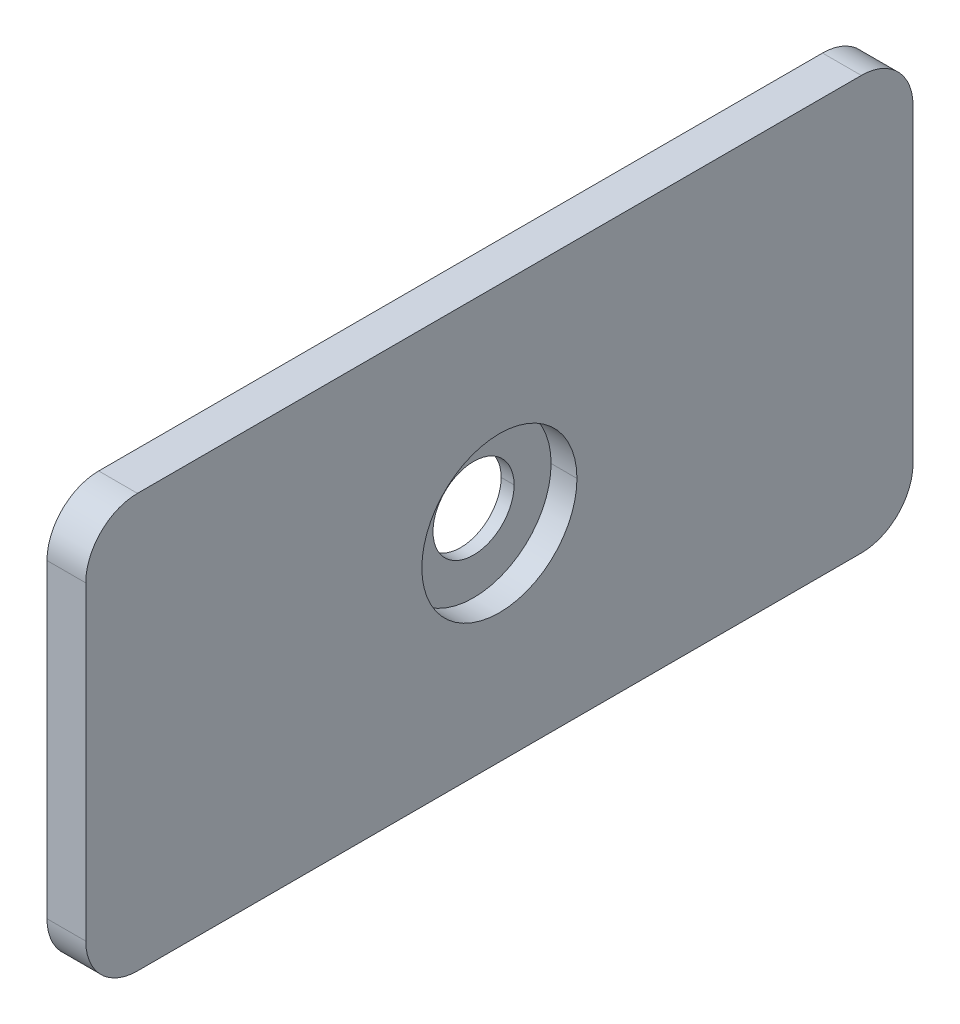
ISO-10303-21;
HEADER;
FILE_DESCRIPTION(('STEP AP214'),'2;1');
FILE_NAME('part.step','',(''),(''),'','','');
FILE_SCHEMA(('AUTOMOTIVE_DESIGN { 1 0 10303 214 1 1 1 1 }'));
ENDSEC;
DATA;
#1=APPLICATION_CONTEXT('core data for automotive mechanical design processes');
#2=APPLICATION_PROTOCOL_DEFINITION('international standard','automotive_design',2000,#1);
#3=PRODUCT_CONTEXT('',#1,'mechanical');
#4=PRODUCT('Part','Part','',(#3));
#5=PRODUCT_RELATED_PRODUCT_CATEGORY('part','',(#4));
#6=PRODUCT_DEFINITION_FORMATION('','',#4);
#7=PRODUCT_DEFINITION_CONTEXT('part definition',#1,'design');
#8=PRODUCT_DEFINITION('design','',#6,#7);
#9=PRODUCT_DEFINITION_SHAPE('','',#8);
#10=(LENGTH_UNIT() NAMED_UNIT(*) SI_UNIT(.MILLI.,.METRE.));
#11=(NAMED_UNIT(*) PLANE_ANGLE_UNIT() SI_UNIT($,.RADIAN.));
#12=(NAMED_UNIT(*) SI_UNIT($,.STERADIAN.) SOLID_ANGLE_UNIT());
#13=UNCERTAINTY_MEASURE_WITH_UNIT(LENGTH_MEASURE(1.E-05),#10,'distance_accuracy_value','');
#14=(GEOMETRIC_REPRESENTATION_CONTEXT(3) GLOBAL_UNCERTAINTY_ASSIGNED_CONTEXT((#13)) GLOBAL_UNIT_ASSIGNED_CONTEXT((#10,
#11,#12)) REPRESENTATION_CONTEXT('',''));
#15=CARTESIAN_POINT('',(0.,0.,0.));
#16=DIRECTION('',(0.,0.,1.));
#17=DIRECTION('',(1.,0.,0.));
#18=AXIS2_PLACEMENT_3D('',#15,#16,#17);
#19=CARTESIAN_POINT('',(-0.396875,0.,0.));
#20=DIRECTION('',(1.,0.,0.));
#21=DIRECTION('',(0.,0.,-1.));
#22=AXIS2_PLACEMENT_3D('',#19,#20,#21);
#23=CYLINDRICAL_SURFACE('',#22,4.7625);
#24=DIRECTION('',(1.,0.,0.));
#25=VECTOR('',#24,1.);
#26=CARTESIAN_POINT('',(-0.396875,0.,4.7625));
#27=LINE('',#26,#25);
#28=CARTESIAN_POINT('',(-0.396875,0.,4.7625));
#29=VERTEX_POINT('',#28);
#30=CARTESIAN_POINT('',(1.190625,0.,4.7625));
#31=VERTEX_POINT('',#30);
#32=EDGE_CURVE('E188',#29,#31,#27,.T.);
#33=ORIENTED_EDGE('',*,*,#32,.F.);
#34=CARTESIAN_POINT('',(-0.396875,0.,0.));
#35=DIRECTION('',(1.,0.,0.));
#36=DIRECTION('',(0.,0.,-1.));
#37=AXIS2_PLACEMENT_3D('',#34,#35,#36);
#38=CIRCLE('',#37,4.7625);
#39=CARTESIAN_POINT('',(-0.396875,0.,-4.7625));
#40=VERTEX_POINT('',#39);
#41=EDGE_CURVE('E11',#40,#29,#38,.T.);
#42=ORIENTED_EDGE('',*,*,#41,.F.);
#43=DIRECTION('',(1.,0.,0.));
#44=VECTOR('',#43,1.);
#45=CARTESIAN_POINT('',(-0.396875,0.,-4.7625));
#46=LINE('',#45,#44);
#47=CARTESIAN_POINT('',(1.190625,0.,-4.7625));
#48=VERTEX_POINT('',#47);
#49=EDGE_CURVE('E235',#40,#48,#46,.T.);
#50=ORIENTED_EDGE('',*,*,#49,.T.);
#51=CARTESIAN_POINT('',(1.190625,0.,0.));
#52=DIRECTION('',(1.,0.,0.));
#53=DIRECTION('',(0.,0.,-1.));
#54=AXIS2_PLACEMENT_3D('',#51,#52,#53);
#55=CIRCLE('',#54,4.7625);
#56=EDGE_CURVE('E71',#48,#31,#55,.T.);
#57=ORIENTED_EDGE('',*,*,#56,.T.);
#58=EDGE_LOOP('',(#33,#42,#50,#57));
#59=FACE_BOUND('',#58,.T.);
#60=ADVANCED_FACE('F17',(#59),#23,.F.);
#61=CARTESIAN_POINT('',(-0.396875,0.,0.));
#62=DIRECTION('',(1.,0.,0.));
#63=DIRECTION('',(0.,1.,0.));
#64=AXIS2_PLACEMENT_3D('',#61,#62,#63);
#65=PLANE('',#64);
#66=CARTESIAN_POINT('',(-0.396875,0.,0.));
#67=DIRECTION('',(-1.,0.,0.));
#68=DIRECTION('',(0.,0.,-1.));
#69=AXIS2_PLACEMENT_3D('',#66,#67,#68);
#70=CIRCLE('',#69,2.4892);
#71=CARTESIAN_POINT('',(-0.396875,0.,-2.4892));
#72=VERTEX_POINT('',#71);
#73=CARTESIAN_POINT('',(-0.396875,0.,2.4892));
#74=VERTEX_POINT('',#73);
#75=EDGE_CURVE('E201',#72,#74,#70,.T.);
#76=ORIENTED_EDGE('',*,*,#75,.T.);
#77=CARTESIAN_POINT('',(-0.396875,0.,0.));
#78=DIRECTION('',(-1.,0.,0.));
#79=DIRECTION('',(0.,0.,-1.));
#80=AXIS2_PLACEMENT_3D('',#77,#78,#79);
#81=CIRCLE('',#80,2.4892);
#82=EDGE_CURVE('E197',#74,#72,#81,.T.);
#83=ORIENTED_EDGE('',*,*,#82,.T.);
#84=EDGE_LOOP('',(#76,#83));
#85=FACE_BOUND('',#84,.T.);
#86=ORIENTED_EDGE('',*,*,#41,.T.);
#87=CARTESIAN_POINT('',(-0.396875,0.,0.));
#88=DIRECTION('',(1.,0.,0.));
#89=DIRECTION('',(0.,0.,-1.));
#90=AXIS2_PLACEMENT_3D('',#87,#88,#89);
#91=CIRCLE('',#90,4.7625);
#92=EDGE_CURVE('E193',#29,#40,#91,.T.);
#93=ORIENTED_EDGE('',*,*,#92,.T.);
#94=EDGE_LOOP('',(#86,#93));
#95=FACE_BOUND('',#94,.T.);
#96=ADVANCED_FACE('F308',(#85,#95),#65,.T.);
#97=CARTESIAN_POINT('',(1.190625,9.525,22.225));
#98=DIRECTION('',(-1.,0.,0.));
#99=DIRECTION('',(0.,0.,1.));
#100=AXIS2_PLACEMENT_3D('',#97,#98,#99);
#101=CYLINDRICAL_SURFACE('',#100,3.175);
#102=CARTESIAN_POINT('',(1.190625,9.525,22.225));
#103=DIRECTION('',(1.,0.,0.));
#104=DIRECTION('',(0.,0.,1.));
#105=AXIS2_PLACEMENT_3D('',#102,#103,#104);
#106=CIRCLE('',#105,3.175);
#107=CARTESIAN_POINT('',(1.190625,12.7,22.225));
#108=VERTEX_POINT('',#107);
#109=CARTESIAN_POINT('',(1.190625,9.525,25.4));
#110=VERTEX_POINT('',#109);
#111=EDGE_CURVE('E169',#108,#110,#106,.T.);
#112=ORIENTED_EDGE('',*,*,#111,.F.);
#113=DIRECTION('',(1.,0.,0.));
#114=VECTOR('',#113,1.);
#115=CARTESIAN_POINT('',(1.190625,12.7,22.225));
#116=LINE('',#115,#114);
#117=CARTESIAN_POINT('',(-1.190625,12.7,22.225));
#118=VERTEX_POINT('',#117);
#119=EDGE_CURVE('E167',#118,#108,#116,.T.);
#120=ORIENTED_EDGE('',*,*,#119,.F.);
#121=CARTESIAN_POINT('',(-1.190625,9.525,22.225));
#122=DIRECTION('',(-1.,0.,0.));
#123=DIRECTION('',(0.,0.,1.));
#124=AXIS2_PLACEMENT_3D('',#121,#122,#123);
#125=CIRCLE('',#124,3.175);
#126=CARTESIAN_POINT('',(-1.190625,9.525,25.4));
#127=VERTEX_POINT('',#126);
#128=EDGE_CURVE('E152',#127,#118,#125,.T.);
#129=ORIENTED_EDGE('',*,*,#128,.F.);
#130=DIRECTION('',(-1.,0.,0.));
#131=VECTOR('',#130,1.);
#132=CARTESIAN_POINT('',(1.190625,9.525,25.4));
#133=LINE('',#132,#131);
#134=EDGE_CURVE('E210',#110,#127,#133,.T.);
#135=ORIENTED_EDGE('',*,*,#134,.F.);
#136=EDGE_LOOP('',(#112,#120,#129,#135));
#137=FACE_BOUND('',#136,.T.);
#138=ADVANCED_FACE('F168',(#137),#101,.T.);
#139=CARTESIAN_POINT('',(1.190625,9.525,-22.225));
#140=DIRECTION('',(-1.,0.,0.));
#141=DIRECTION('',(0.,0.,1.));
#142=AXIS2_PLACEMENT_3D('',#139,#140,#141);
#143=CYLINDRICAL_SURFACE('',#142,3.175);
#144=CARTESIAN_POINT('',(1.190625,9.525,-22.225));
#145=DIRECTION('',(1.,0.,0.));
#146=DIRECTION('',(0.,0.,1.));
#147=AXIS2_PLACEMENT_3D('',#144,#145,#146);
#148=CIRCLE('',#147,3.175);
#149=CARTESIAN_POINT('',(1.190625,9.525,-25.4));
#150=VERTEX_POINT('',#149);
#151=CARTESIAN_POINT('',(1.190625,12.7,-22.225));
#152=VERTEX_POINT('',#151);
#153=EDGE_CURVE('E218',#150,#152,#148,.T.);
#154=ORIENTED_EDGE('',*,*,#153,.F.);
#155=DIRECTION('',(1.,0.,0.));
#156=VECTOR('',#155,1.);
#157=CARTESIAN_POINT('',(1.190625,9.525,-25.4));
#158=LINE('',#157,#156);
#159=CARTESIAN_POINT('',(-1.190625,9.525,-25.4));
#160=VERTEX_POINT('',#159);
#161=EDGE_CURVE('E254',#160,#150,#158,.T.);
#162=ORIENTED_EDGE('',*,*,#161,.F.);
#163=CARTESIAN_POINT('',(-1.190625,9.525,-22.225));
#164=DIRECTION('',(-1.,0.,0.));
#165=DIRECTION('',(0.,0.,1.));
#166=AXIS2_PLACEMENT_3D('',#163,#164,#165);
#167=CIRCLE('',#166,3.175);
#168=CARTESIAN_POINT('',(-1.190625,12.7,-22.225));
#169=VERTEX_POINT('',#168);
#170=EDGE_CURVE('E27',#169,#160,#167,.T.);
#171=ORIENTED_EDGE('',*,*,#170,.F.);
#172=DIRECTION('',(-1.,0.,0.));
#173=VECTOR('',#172,1.);
#174=CARTESIAN_POINT('',(1.190625,12.7,-22.225));
#175=LINE('',#174,#173);
#176=EDGE_CURVE('E21',#152,#169,#175,.T.);
#177=ORIENTED_EDGE('',*,*,#176,.F.);
#178=EDGE_LOOP('',(#154,#162,#171,#177));
#179=FACE_BOUND('',#178,.T.);
#180=ADVANCED_FACE('F353',(#179),#143,.T.);
#181=CARTESIAN_POINT('',(1.190625,-9.525,22.225));
#182=DIRECTION('',(-1.,0.,0.));
#183=DIRECTION('',(0.,0.,1.));
#184=AXIS2_PLACEMENT_3D('',#181,#182,#183);
#185=CYLINDRICAL_SURFACE('',#184,3.175);
#186=CARTESIAN_POINT('',(1.190625,-9.525,22.225));
#187=DIRECTION('',(1.,0.,0.));
#188=DIRECTION('',(0.,0.,1.));
#189=AXIS2_PLACEMENT_3D('',#186,#187,#188);
#190=CIRCLE('',#189,3.175);
#191=CARTESIAN_POINT('',(1.190625,-9.525,25.4));
#192=VERTEX_POINT('',#191);
#193=CARTESIAN_POINT('',(1.190625,-12.7,22.225));
#194=VERTEX_POINT('',#193);
#195=EDGE_CURVE('E41',#192,#194,#190,.T.);
#196=ORIENTED_EDGE('',*,*,#195,.F.);
#197=DIRECTION('',(1.,0.,0.));
#198=VECTOR('',#197,1.);
#199=CARTESIAN_POINT('',(1.190625,-9.525,25.4));
#200=LINE('',#199,#198);
#201=CARTESIAN_POINT('',(-1.190625,-9.525,25.4));
#202=VERTEX_POINT('',#201);
#203=EDGE_CURVE('E196',#202,#192,#200,.T.);
#204=ORIENTED_EDGE('',*,*,#203,.F.);
#205=CARTESIAN_POINT('',(-1.190625,-9.525,22.225));
#206=DIRECTION('',(-1.,0.,0.));
#207=DIRECTION('',(0.,0.,1.));
#208=AXIS2_PLACEMENT_3D('',#205,#206,#207);
#209=CIRCLE('',#208,3.175);
#210=CARTESIAN_POINT('',(-1.190625,-12.7,22.225));
#211=VERTEX_POINT('',#210);
#212=EDGE_CURVE('E165',#211,#202,#209,.T.);
#213=ORIENTED_EDGE('',*,*,#212,.F.);
#214=DIRECTION('',(-1.,0.,0.));
#215=VECTOR('',#214,1.);
#216=CARTESIAN_POINT('',(1.190625,-12.7,22.225));
#217=LINE('',#216,#215);
#218=EDGE_CURVE('E224',#194,#211,#217,.T.);
#219=ORIENTED_EDGE('',*,*,#218,.F.);
#220=EDGE_LOOP('',(#196,#204,#213,#219));
#221=FACE_BOUND('',#220,.T.);
#222=ADVANCED_FACE('F267',(#221),#185,.T.);
#223=CARTESIAN_POINT('',(1.190625,-9.525,-22.225));
#224=DIRECTION('',(-1.,0.,0.));
#225=DIRECTION('',(0.,0.,1.));
#226=AXIS2_PLACEMENT_3D('',#223,#224,#225);
#227=CYLINDRICAL_SURFACE('',#226,3.175);
#228=CARTESIAN_POINT('',(1.190625,-9.525,-22.225));
#229=DIRECTION('',(1.,0.,0.));
#230=DIRECTION('',(0.,0.,1.));
#231=AXIS2_PLACEMENT_3D('',#228,#229,#230);
#232=CIRCLE('',#231,3.175);
#233=CARTESIAN_POINT('',(1.190625,-12.7,-22.225));
#234=VERTEX_POINT('',#233);
#235=CARTESIAN_POINT('',(1.190625,-9.525,-25.4));
#236=VERTEX_POINT('',#235);
#237=EDGE_CURVE('E54',#234,#236,#232,.T.);
#238=ORIENTED_EDGE('',*,*,#237,.F.);
#239=DIRECTION('',(1.,0.,0.));
#240=VECTOR('',#239,1.);
#241=CARTESIAN_POINT('',(1.190625,-12.7,-22.225));
#242=LINE('',#241,#240);
#243=CARTESIAN_POINT('',(-1.190625,-12.7,-22.225));
#244=VERTEX_POINT('',#243);
#245=EDGE_CURVE('E223',#244,#234,#242,.T.);
#246=ORIENTED_EDGE('',*,*,#245,.F.);
#247=CARTESIAN_POINT('',(-1.190625,-9.525,-22.225));
#248=DIRECTION('',(-1.,0.,0.));
#249=DIRECTION('',(0.,0.,1.));
#250=AXIS2_PLACEMENT_3D('',#247,#248,#249);
#251=CIRCLE('',#250,3.175);
#252=CARTESIAN_POINT('',(-1.190625,-9.525,-25.4));
#253=VERTEX_POINT('',#252);
#254=EDGE_CURVE('E213',#253,#244,#251,.T.);
#255=ORIENTED_EDGE('',*,*,#254,.F.);
#256=DIRECTION('',(-1.,0.,0.));
#257=VECTOR('',#256,1.);
#258=CARTESIAN_POINT('',(1.190625,-9.525,-25.4));
#259=LINE('',#258,#257);
#260=EDGE_CURVE('E240',#236,#253,#259,.T.);
#261=ORIENTED_EDGE('',*,*,#260,.F.);
#262=EDGE_LOOP('',(#238,#246,#255,#261));
#263=FACE_BOUND('',#262,.T.);
#264=ADVANCED_FACE('F325',(#263),#227,.T.);
#265=CARTESIAN_POINT('',(-1.190625,0.,0.));
#266=DIRECTION('',(-1.,0.,0.));
#267=DIRECTION('',(0.,0.,1.));
#268=AXIS2_PLACEMENT_3D('',#265,#266,#267);
#269=PLANE('',#268);
#270=CARTESIAN_POINT('',(-1.190625,0.,0.));
#271=DIRECTION('',(1.,0.,0.));
#272=DIRECTION('',(0.,0.,-1.));
#273=AXIS2_PLACEMENT_3D('',#270,#271,#272);
#274=CIRCLE('',#273,2.4892);
#275=CARTESIAN_POINT('',(-1.190625,0.,-2.4892));
#276=VERTEX_POINT('',#275);
#277=CARTESIAN_POINT('',(-1.190625,0.,2.4892));
#278=VERTEX_POINT('',#277);
#279=EDGE_CURVE('E200',#276,#278,#274,.T.);
#280=ORIENTED_EDGE('',*,*,#279,.T.);
#281=CARTESIAN_POINT('',(-1.190625,0.,0.));
#282=DIRECTION('',(1.,0.,0.));
#283=DIRECTION('',(0.,0.,-1.));
#284=AXIS2_PLACEMENT_3D('',#281,#282,#283);
#285=CIRCLE('',#284,2.4892);
#286=EDGE_CURVE('E231',#278,#276,#285,.T.);
#287=ORIENTED_EDGE('',*,*,#286,.T.);
#288=EDGE_LOOP('',(#280,#287));
#289=FACE_BOUND('',#288,.T.);
#290=DIRECTION('',(0.,1.,0.));
#291=VECTOR('',#290,1.);
#292=CARTESIAN_POINT('',(-1.190625,-12.7,-25.4));
#293=LINE('',#292,#291);
#294=EDGE_CURVE('E244',#253,#160,#293,.T.);
#295=ORIENTED_EDGE('',*,*,#294,.F.);
#296=ORIENTED_EDGE('',*,*,#254,.T.);
#297=DIRECTION('',(0.,0.,-1.));
#298=VECTOR('',#297,1.);
#299=CARTESIAN_POINT('',(-1.190625,-12.7,25.4));
#300=LINE('',#299,#298);
#301=EDGE_CURVE('E219',#211,#244,#300,.T.);
#302=ORIENTED_EDGE('',*,*,#301,.F.);
#303=ORIENTED_EDGE('',*,*,#212,.T.);
#304=DIRECTION('',(0.,-1.,0.));
#305=VECTOR('',#304,1.);
#306=CARTESIAN_POINT('',(-1.190625,-12.7,25.4));
#307=LINE('',#306,#305);
#308=EDGE_CURVE('E160',#127,#202,#307,.T.);
#309=ORIENTED_EDGE('',*,*,#308,.F.);
#310=ORIENTED_EDGE('',*,*,#128,.T.);
#311=DIRECTION('',(0.,0.,1.));
#312=VECTOR('',#311,1.);
#313=CARTESIAN_POINT('',(-1.190625,12.7,25.4));
#314=LINE('',#313,#312);
#315=EDGE_CURVE('E157',#169,#118,#314,.T.);
#316=ORIENTED_EDGE('',*,*,#315,.F.);
#317=ORIENTED_EDGE('',*,*,#170,.T.);
#318=EDGE_LOOP('',(#295,#296,#302,#303,#309,#310,#316,#317));
#319=FACE_BOUND('',#318,.T.);
#320=ADVANCED_FACE('F155',(#289,#319),#269,.T.);
#321=CARTESIAN_POINT('',(1.190625,0.,0.));
#322=DIRECTION('',(-1.,0.,0.));
#323=DIRECTION('',(0.,0.,1.));
#324=AXIS2_PLACEMENT_3D('',#321,#322,#323);
#325=PLANE('',#324);
#326=ORIENTED_EDGE('',*,*,#56,.F.);
#327=CARTESIAN_POINT('',(1.190625,0.,0.));
#328=DIRECTION('',(1.,0.,0.));
#329=DIRECTION('',(0.,0.,-1.));
#330=AXIS2_PLACEMENT_3D('',#327,#328,#329);
#331=CIRCLE('',#330,4.7625);
#332=EDGE_CURVE('E192',#31,#48,#331,.T.);
#333=ORIENTED_EDGE('',*,*,#332,.F.);
#334=EDGE_LOOP('',(#326,#333));
#335=FACE_BOUND('',#334,.T.);
#336=DIRECTION('',(0.,0.,-1.));
#337=VECTOR('',#336,1.);
#338=CARTESIAN_POINT('',(1.190625,-12.7,25.4));
#339=LINE('',#338,#337);
#340=EDGE_CURVE('E228',#194,#234,#339,.T.);
#341=ORIENTED_EDGE('',*,*,#340,.T.);
#342=ORIENTED_EDGE('',*,*,#237,.T.);
#343=DIRECTION('',(0.,1.,0.));
#344=VECTOR('',#343,1.);
#345=CARTESIAN_POINT('',(1.190625,-12.7,-25.4));
#346=LINE('',#345,#344);
#347=EDGE_CURVE('E186',#236,#150,#346,.T.);
#348=ORIENTED_EDGE('',*,*,#347,.T.);
#349=ORIENTED_EDGE('',*,*,#153,.T.);
#350=DIRECTION('',(0.,0.,1.));
#351=VECTOR('',#350,1.);
#352=CARTESIAN_POINT('',(1.190625,12.7,25.4));
#353=LINE('',#352,#351);
#354=EDGE_CURVE('E183',#152,#108,#353,.T.);
#355=ORIENTED_EDGE('',*,*,#354,.T.);
#356=ORIENTED_EDGE('',*,*,#111,.T.);
#357=DIRECTION('',(0.,-1.,0.));
#358=VECTOR('',#357,1.);
#359=CARTESIAN_POINT('',(1.190625,-12.7,25.4));
#360=LINE('',#359,#358);
#361=EDGE_CURVE('E207',#110,#192,#360,.T.);
#362=ORIENTED_EDGE('',*,*,#361,.T.);
#363=ORIENTED_EDGE('',*,*,#195,.T.);
#364=EDGE_LOOP('',(#341,#342,#348,#349,#355,#356,#362,#363));
#365=FACE_BOUND('',#364,.T.);
#366=ADVANCED_FACE('F263',(#335,#365),#325,.F.);
#367=CARTESIAN_POINT('',(1.190625,-12.7,25.4));
#368=DIRECTION('',(0.,1.,0.));
#369=DIRECTION('',(1.,0.,0.));
#370=AXIS2_PLACEMENT_3D('',#367,#368,#369);
#371=PLANE('',#370);
#372=ORIENTED_EDGE('',*,*,#301,.T.);
#373=ORIENTED_EDGE('',*,*,#245,.T.);
#374=ORIENTED_EDGE('',*,*,#340,.F.);
#375=ORIENTED_EDGE('',*,*,#218,.T.);
#376=EDGE_LOOP('',(#372,#373,#374,#375));
#377=FACE_BOUND('',#376,.T.);
#378=ADVANCED_FACE('F271',(#377),#371,.F.);
#379=CARTESIAN_POINT('',(1.190625,-12.7,25.4));
#380=DIRECTION('',(0.,0.,-1.));
#381=DIRECTION('',(0.,-1.,0.));
#382=AXIS2_PLACEMENT_3D('',#379,#380,#381);
#383=PLANE('',#382);
#384=ORIENTED_EDGE('',*,*,#308,.T.);
#385=ORIENTED_EDGE('',*,*,#203,.T.);
#386=ORIENTED_EDGE('',*,*,#361,.F.);
#387=ORIENTED_EDGE('',*,*,#134,.T.);
#388=EDGE_LOOP('',(#384,#385,#386,#387));
#389=FACE_BOUND('',#388,.T.);
#390=ADVANCED_FACE('F260',(#389),#383,.F.);
#391=CARTESIAN_POINT('',(1.190625,12.7,25.4));
#392=DIRECTION('',(0.,-1.,0.));
#393=DIRECTION('',(0.,0.,-1.));
#394=AXIS2_PLACEMENT_3D('',#391,#392,#393);
#395=PLANE('',#394);
#396=ORIENTED_EDGE('',*,*,#354,.F.);
#397=ORIENTED_EDGE('',*,*,#176,.T.);
#398=ORIENTED_EDGE('',*,*,#315,.T.);
#399=ORIENTED_EDGE('',*,*,#119,.T.);
#400=EDGE_LOOP('',(#396,#397,#398,#399));
#401=FACE_BOUND('',#400,.T.);
#402=ADVANCED_FACE('F175',(#401),#395,.F.);
#403=CARTESIAN_POINT('',(1.190625,-12.7,-25.4));
#404=DIRECTION('',(0.,0.,1.));
#405=DIRECTION('',(1.,0.,0.));
#406=AXIS2_PLACEMENT_3D('',#403,#404,#405);
#407=PLANE('',#406);
#408=ORIENTED_EDGE('',*,*,#347,.F.);
#409=ORIENTED_EDGE('',*,*,#260,.T.);
#410=ORIENTED_EDGE('',*,*,#294,.T.);
#411=ORIENTED_EDGE('',*,*,#161,.T.);
#412=EDGE_LOOP('',(#408,#409,#410,#411));
#413=FACE_BOUND('',#412,.T.);
#414=ADVANCED_FACE('F19',(#413),#407,.F.);
#415=CARTESIAN_POINT('',(-1.190625,0.,0.));
#416=DIRECTION('',(1.,0.,0.));
#417=DIRECTION('',(0.,0.,-1.));
#418=AXIS2_PLACEMENT_3D('',#415,#416,#417);
#419=CYLINDRICAL_SURFACE('',#418,2.4892);
#420=DIRECTION('',(1.,0.,0.));
#421=VECTOR('',#420,1.);
#422=CARTESIAN_POINT('',(-1.190625,0.,2.4892));
#423=LINE('',#422,#421);
#424=EDGE_CURVE('E206',#278,#74,#423,.T.);
#425=ORIENTED_EDGE('',*,*,#424,.F.);
#426=ORIENTED_EDGE('',*,*,#279,.F.);
#427=DIRECTION('',(1.,0.,0.));
#428=VECTOR('',#427,1.);
#429=CARTESIAN_POINT('',(-1.190625,0.,-2.4892));
#430=LINE('',#429,#428);
#431=EDGE_CURVE('E205',#276,#72,#430,.T.);
#432=ORIENTED_EDGE('',*,*,#431,.T.);
#433=ORIENTED_EDGE('',*,*,#82,.F.);
#434=EDGE_LOOP('',(#425,#426,#432,#433));
#435=FACE_BOUND('',#434,.T.);
#436=ADVANCED_FACE('F306',(#435),#419,.F.);
#437=CARTESIAN_POINT('',(-1.190625,0.,0.));
#438=DIRECTION('',(1.,0.,0.));
#439=DIRECTION('',(0.,0.,-1.));
#440=AXIS2_PLACEMENT_3D('',#437,#438,#439);
#441=CYLINDRICAL_SURFACE('',#440,2.4892);
#442=ORIENTED_EDGE('',*,*,#286,.F.);
#443=ORIENTED_EDGE('',*,*,#424,.T.);
#444=ORIENTED_EDGE('',*,*,#75,.F.);
#445=ORIENTED_EDGE('',*,*,#431,.F.);
#446=EDGE_LOOP('',(#442,#443,#444,#445));
#447=FACE_BOUND('',#446,.T.);
#448=ADVANCED_FACE('F303',(#447),#441,.F.);
#449=CARTESIAN_POINT('',(-0.396875,0.,0.));
#450=DIRECTION('',(1.,0.,0.));
#451=DIRECTION('',(0.,0.,-1.));
#452=AXIS2_PLACEMENT_3D('',#449,#450,#451);
#453=CYLINDRICAL_SURFACE('',#452,4.7625);
#454=ORIENTED_EDGE('',*,*,#92,.F.);
#455=ORIENTED_EDGE('',*,*,#32,.T.);
#456=ORIENTED_EDGE('',*,*,#332,.T.);
#457=ORIENTED_EDGE('',*,*,#49,.F.);
#458=EDGE_LOOP('',(#454,#455,#456,#457));
#459=FACE_BOUND('',#458,.T.);
#460=ADVANCED_FACE('F315',(#459),#453,.F.);
#461=CLOSED_SHELL('',(#60,#96,#138,#180,#222,#264,#320,#366,#378,#390,#402,#414,#436,#448,#460));
#462=MANIFOLD_SOLID_BREP('B1',#461);
#463=ADVANCED_BREP_SHAPE_REPRESENTATION('',(#18,#462),#14);
#464=SHAPE_DEFINITION_REPRESENTATION(#9,#463);
ENDSEC;
END-ISO-10303-21;
